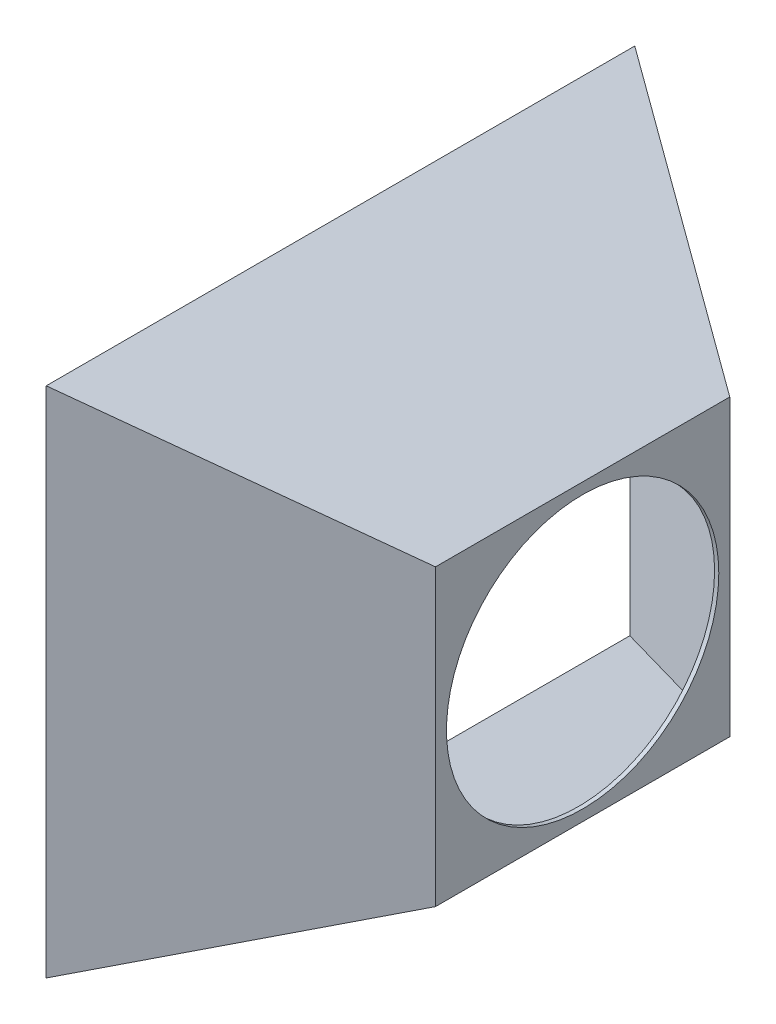
ISO-10303-21;
HEADER;
FILE_DESCRIPTION(('STEP AP214'),'2;1');
FILE_NAME('part.step','',(''),(''),'','','');
FILE_SCHEMA(('AUTOMOTIVE_DESIGN { 1 0 10303 214 1 1 1 1 }'));
ENDSEC;
DATA;
#1=APPLICATION_CONTEXT('core data for automotive mechanical design processes');
#2=APPLICATION_PROTOCOL_DEFINITION('international standard','automotive_design',2000,#1);
#3=PRODUCT_CONTEXT('',#1,'mechanical');
#4=PRODUCT('Part','Part','',(#3));
#5=PRODUCT_RELATED_PRODUCT_CATEGORY('part','',(#4));
#6=PRODUCT_DEFINITION_FORMATION('','',#4);
#7=PRODUCT_DEFINITION_CONTEXT('part definition',#1,'design');
#8=PRODUCT_DEFINITION('design','',#6,#7);
#9=PRODUCT_DEFINITION_SHAPE('','',#8);
#10=(LENGTH_UNIT() NAMED_UNIT(*) SI_UNIT(.MILLI.,.METRE.));
#11=(NAMED_UNIT(*) PLANE_ANGLE_UNIT() SI_UNIT($,.RADIAN.));
#12=(NAMED_UNIT(*) SI_UNIT($,.STERADIAN.) SOLID_ANGLE_UNIT());
#13=UNCERTAINTY_MEASURE_WITH_UNIT(LENGTH_MEASURE(1.E-05),#10,'distance_accuracy_value','');
#14=(GEOMETRIC_REPRESENTATION_CONTEXT(3) GLOBAL_UNCERTAINTY_ASSIGNED_CONTEXT((#13)) GLOBAL_UNIT_ASSIGNED_CONTEXT((#10,
#11,#12)) REPRESENTATION_CONTEXT('',''));
#15=CARTESIAN_POINT('',(0.,0.,0.));
#16=DIRECTION('',(0.,0.,1.));
#17=DIRECTION('',(1.,0.,0.));
#18=AXIS2_PLACEMENT_3D('',#15,#16,#17);
#19=CARTESIAN_POINT('',(288.,0.,0.));
#20=DIRECTION('',(1.,0.,0.));
#21=DIRECTION('',(0.,0.,-1.));
#22=AXIS2_PLACEMENT_3D('',#19,#20,#21);
#23=PLANE('',#22);
#24=CARTESIAN_POINT('',(288.,0.,0.));
#25=DIRECTION('',(1.,0.,0.));
#26=DIRECTION('',(0.,0.,-1.));
#27=AXIS2_PLACEMENT_3D('',#24,#25,#26);
#28=CIRCLE('',#27,161.95);
#29=CARTESIAN_POINT('',(288.,0.,-161.95));
#30=VERTEX_POINT('',#29);
#31=EDGE_CURVE('E310',#30,#30,#28,.T.);
#32=ORIENTED_EDGE('',*,*,#31,.F.);
#33=EDGE_LOOP('',(#32));
#34=FACE_BOUND('',#33,.T.);
#35=DIRECTION('',(0.,-1.,0.));
#36=VECTOR('',#35,1.);
#37=CARTESIAN_POINT('',(288.,-175.,175.));
#38=LINE('',#37,#36);
#39=CARTESIAN_POINT('',(288.,175.,175.));
#40=VERTEX_POINT('',#39);
#41=CARTESIAN_POINT('',(288.,-175.,175.));
#42=VERTEX_POINT('',#41);
#43=EDGE_CURVE('E250',#40,#42,#38,.T.);
#44=ORIENTED_EDGE('',*,*,#43,.T.);
#45=DIRECTION('',(0.,0.,-1.));
#46=VECTOR('',#45,1.);
#47=CARTESIAN_POINT('',(288.,-175.,-175.));
#48=LINE('',#47,#46);
#49=CARTESIAN_POINT('',(288.,-175.,-175.));
#50=VERTEX_POINT('',#49);
#51=EDGE_CURVE('E12',#42,#50,#48,.T.);
#52=ORIENTED_EDGE('',*,*,#51,.T.);
#53=DIRECTION('',(0.,1.,0.));
#54=VECTOR('',#53,1.);
#55=CARTESIAN_POINT('',(288.,-175.,-175.));
#56=LINE('',#55,#54);
#57=CARTESIAN_POINT('',(288.,175.,-175.));
#58=VERTEX_POINT('',#57);
#59=EDGE_CURVE('E51',#50,#58,#56,.T.);
#60=ORIENTED_EDGE('',*,*,#59,.T.);
#61=DIRECTION('',(0.,0.,1.));
#62=VECTOR('',#61,1.);
#63=CARTESIAN_POINT('',(288.,175.,-175.));
#64=LINE('',#63,#62);
#65=EDGE_CURVE('E252',#58,#40,#64,.T.);
#66=ORIENTED_EDGE('',*,*,#65,.T.);
#67=EDGE_LOOP('',(#44,#52,#60,#66));
#68=FACE_BOUND('',#67,.T.);
#69=ADVANCED_FACE('F42',(#34,#68),#23,.T.);
#70=CARTESIAN_POINT('',(0.,0.,0.));
#71=DIRECTION('',(1.,0.,0.));
#72=DIRECTION('',(0.,0.,-1.));
#73=AXIS2_PLACEMENT_3D('',#70,#71,#72);
#74=PLANE('',#73);
#75=DIRECTION('',(0.,0.,1.));
#76=VECTOR('',#75,1.);
#77=CARTESIAN_POINT('',(0.,299.514218540143,0.));
#78=LINE('',#77,#76);
#79=CARTESIAN_POINT('',(0.,299.514218540143,-344.149305555555));
#80=VERTEX_POINT('',#79);
#81=CARTESIAN_POINT('',(0.,299.514218540143,344.149305555555));
#82=VERTEX_POINT('',#81);
#83=EDGE_CURVE('E137',#80,#82,#78,.T.);
#84=ORIENTED_EDGE('',*,*,#83,.T.);
#85=DIRECTION('',(0.,-1.,0.));
#86=VECTOR('',#85,1.);
#87=CARTESIAN_POINT('',(0.,0.,344.149305555555));
#88=LINE('',#87,#86);
#89=CARTESIAN_POINT('',(0.,-299.514218540143,344.149305555555));
#90=VERTEX_POINT('',#89);
#91=EDGE_CURVE('E140',#82,#90,#88,.T.);
#92=ORIENTED_EDGE('',*,*,#91,.T.);
#93=DIRECTION('',(0.,0.,-1.));
#94=VECTOR('',#93,1.);
#95=CARTESIAN_POINT('',(0.,-299.514218540143,0.));
#96=LINE('',#95,#94);
#97=CARTESIAN_POINT('',(0.,-299.514218540143,-344.149305555555));
#98=VERTEX_POINT('',#97);
#99=EDGE_CURVE('E142',#90,#98,#96,.T.);
#100=ORIENTED_EDGE('',*,*,#99,.T.);
#101=DIRECTION('',(0.,1.,0.));
#102=VECTOR('',#101,1.);
#103=CARTESIAN_POINT('',(0.,0.,-344.149305555555));
#104=LINE('',#103,#102);
#105=EDGE_CURVE('E59',#98,#80,#104,.T.);
#106=ORIENTED_EDGE('',*,*,#105,.T.);
#107=EDGE_LOOP('',(#84,#92,#100,#106));
#108=FACE_BOUND('',#107,.T.);
#109=DIRECTION('',(0.,-1.,0.));
#110=VECTOR('',#109,1.);
#111=CARTESIAN_POINT('',(0.,-305.,350.));
#112=LINE('',#111,#110);
#113=CARTESIAN_POINT('',(0.,305.,350.));
#114=VERTEX_POINT('',#113);
#115=CARTESIAN_POINT('',(0.,-305.,350.));
#116=VERTEX_POINT('',#115);
#117=EDGE_CURVE('E120',#114,#116,#112,.T.);
#118=ORIENTED_EDGE('',*,*,#117,.F.);
#119=DIRECTION('',(0.,0.,1.));
#120=VECTOR('',#119,1.);
#121=CARTESIAN_POINT('',(0.,305.,-350.));
#122=LINE('',#121,#120);
#123=CARTESIAN_POINT('',(0.,305.,-350.));
#124=VERTEX_POINT('',#123);
#125=EDGE_CURVE('E224',#124,#114,#122,.T.);
#126=ORIENTED_EDGE('',*,*,#125,.F.);
#127=DIRECTION('',(0.,1.,0.));
#128=VECTOR('',#127,1.);
#129=CARTESIAN_POINT('',(0.,-305.,-350.));
#130=LINE('',#129,#128);
#131=CARTESIAN_POINT('',(0.,-305.,-350.));
#132=VERTEX_POINT('',#131);
#133=EDGE_CURVE('E356',#132,#124,#130,.T.);
#134=ORIENTED_EDGE('',*,*,#133,.F.);
#135=DIRECTION('',(0.,0.,-1.));
#136=VECTOR('',#135,1.);
#137=CARTESIAN_POINT('',(0.,-305.,-350.));
#138=LINE('',#137,#136);
#139=EDGE_CURVE('E151',#116,#132,#138,.T.);
#140=ORIENTED_EDGE('',*,*,#139,.F.);
#141=EDGE_LOOP('',(#118,#126,#134,#140));
#142=FACE_BOUND('',#141,.T.);
#143=ADVANCED_FACE('F299',(#108,#142),#74,.F.);
#144=CARTESIAN_POINT('',(114.370417851849,253.374464164096,0.));
#145=DIRECTION('',(-0.41141712643131,-0.911447172401672,0.));
#146=DIRECTION('',(0.911447172401672,-0.41141712643131,0.));
#147=AXIS2_PLACEMENT_3D('',#144,#145,#146);
#148=PLANE('',#147);
#149=DIRECTION('',(0.797331314407417,-0.359906496086681,-0.48448951396284));
#150=VECTOR('',#149,1.);
#151=CARTESIAN_POINT('',(0.,305.,350.));
#152=LINE('',#151,#150);
#153=EDGE_CURVE('E216',#114,#40,#152,.T.);
#154=ORIENTED_EDGE('',*,*,#153,.T.);
#155=ORIENTED_EDGE('',*,*,#65,.F.);
#156=DIRECTION('',(0.797331314407417,-0.359906496086681,0.48448951396284));
#157=VECTOR('',#156,1.);
#158=CARTESIAN_POINT('',(0.,305.,-350.));
#159=LINE('',#158,#157);
#160=EDGE_CURVE('E209',#124,#58,#159,.T.);
#161=ORIENTED_EDGE('',*,*,#160,.F.);
#162=ORIENTED_EDGE('',*,*,#125,.T.);
#163=EDGE_LOOP('',(#154,#155,#161,#162));
#164=FACE_BOUND('',#163,.T.);
#165=ADVANCED_FACE('F199',(#164),#148,.F.);
#166=CARTESIAN_POINT('',(155.324076112319,0.,-255.619050973417));
#167=DIRECTION('',(-0.519287833827893,0.,0.85459940652819));
#168=DIRECTION('',(0.85459940652819,0.,0.519287833827893));
#169=AXIS2_PLACEMENT_3D('',#166,#167,#168);
#170=PLANE('',#169);
#171=ORIENTED_EDGE('',*,*,#160,.T.);
#172=ORIENTED_EDGE('',*,*,#59,.F.);
#173=DIRECTION('',(0.797331314407417,0.359906496086681,0.48448951396284));
#174=VECTOR('',#173,1.);
#175=CARTESIAN_POINT('',(0.,-305.,-350.));
#176=LINE('',#175,#174);
#177=EDGE_CURVE('E249',#132,#50,#176,.T.);
#178=ORIENTED_EDGE('',*,*,#177,.F.);
#179=ORIENTED_EDGE('',*,*,#133,.T.);
#180=EDGE_LOOP('',(#171,#172,#178,#179));
#181=FACE_BOUND('',#180,.T.);
#182=ADVANCED_FACE('F190',(#181),#170,.F.);
#183=CARTESIAN_POINT('',(155.324076112319,0.,255.619050973417));
#184=DIRECTION('',(-0.519287833827893,0.,-0.85459940652819));
#185=DIRECTION('',(-0.85459940652819,0.,0.519287833827893));
#186=AXIS2_PLACEMENT_3D('',#183,#184,#185);
#187=PLANE('',#186);
#188=DIRECTION('',(0.797331314407417,0.359906496086681,-0.48448951396284));
#189=VECTOR('',#188,1.);
#190=CARTESIAN_POINT('',(0.,-305.,350.));
#191=LINE('',#190,#189);
#192=EDGE_CURVE('E67',#116,#42,#191,.T.);
#193=ORIENTED_EDGE('',*,*,#192,.T.);
#194=ORIENTED_EDGE('',*,*,#43,.F.);
#195=ORIENTED_EDGE('',*,*,#153,.F.);
#196=ORIENTED_EDGE('',*,*,#117,.T.);
#197=EDGE_LOOP('',(#193,#194,#195,#196));
#198=FACE_BOUND('',#197,.T.);
#199=ADVANCED_FACE('F166',(#198),#187,.F.);
#200=CARTESIAN_POINT('',(114.370417851849,-253.374464164096,0.));
#201=DIRECTION('',(-0.411417126431311,0.911447172401672,0.));
#202=DIRECTION('',(-0.911447172401672,-0.411417126431311,0.));
#203=AXIS2_PLACEMENT_3D('',#200,#201,#202);
#204=PLANE('',#203);
#205=ORIENTED_EDGE('',*,*,#177,.T.);
#206=ORIENTED_EDGE('',*,*,#51,.F.);
#207=ORIENTED_EDGE('',*,*,#192,.F.);
#208=ORIENTED_EDGE('',*,*,#139,.T.);
#209=EDGE_LOOP('',(#205,#206,#207,#208));
#210=FACE_BOUND('',#209,.T.);
#211=ADVANCED_FACE('F157',(#210),#204,.F.);
#212=CARTESIAN_POINT('',(283.,0.,0.));
#213=DIRECTION('',(1.,0.,0.));
#214=DIRECTION('',(0.,0.,-1.));
#215=AXIS2_PLACEMENT_3D('',#212,#213,#214);
#216=PLANE('',#215);
#217=CARTESIAN_POINT('',(283.,0.,0.));
#218=DIRECTION('',(1.,0.,0.));
#219=DIRECTION('',(0.,0.,-1.));
#220=AXIS2_PLACEMENT_3D('',#217,#218,#219);
#221=CIRCLE('',#220,161.95);
#222=CARTESIAN_POINT('',(283.,0.,-161.95));
#223=VERTEX_POINT('',#222);
#224=EDGE_CURVE('E46',#223,#223,#221,.T.);
#225=ORIENTED_EDGE('',*,*,#224,.T.);
#226=EDGE_LOOP('',(#225));
#227=FACE_BOUND('',#226,.T.);
#228=DIRECTION('',(0.,-1.,0.));
#229=VECTOR('',#228,1.);
#230=CARTESIAN_POINT('',(283.,0.,172.1875));
#231=LINE('',#230,#229);
#232=CARTESIAN_POINT('',(283.,171.771162984588,172.1875));
#233=VERTEX_POINT('',#232);
#234=CARTESIAN_POINT('',(283.,-171.771162984588,172.1875));
#235=VERTEX_POINT('',#234);
#236=EDGE_CURVE('E129',#233,#235,#231,.T.);
#237=ORIENTED_EDGE('',*,*,#236,.F.);
#238=DIRECTION('',(0.,0.,1.));
#239=VECTOR('',#238,1.);
#240=CARTESIAN_POINT('',(283.,171.771162984588,0.));
#241=LINE('',#240,#239);
#242=CARTESIAN_POINT('',(283.,171.771162984588,-172.1875));
#243=VERTEX_POINT('',#242);
#244=EDGE_CURVE('E125',#243,#233,#241,.T.);
#245=ORIENTED_EDGE('',*,*,#244,.F.);
#246=DIRECTION('',(0.,1.,0.));
#247=VECTOR('',#246,1.);
#248=CARTESIAN_POINT('',(283.,0.,-172.1875));
#249=LINE('',#248,#247);
#250=CARTESIAN_POINT('',(283.,-171.771162984588,-172.1875));
#251=VERTEX_POINT('',#250);
#252=EDGE_CURVE('E121',#251,#243,#249,.T.);
#253=ORIENTED_EDGE('',*,*,#252,.F.);
#254=DIRECTION('',(0.,0.,-1.));
#255=VECTOR('',#254,1.);
#256=CARTESIAN_POINT('',(283.,-171.771162984588,0.));
#257=LINE('',#256,#255);
#258=EDGE_CURVE('E110',#235,#251,#257,.T.);
#259=ORIENTED_EDGE('',*,*,#258,.F.);
#260=EDGE_LOOP('',(#237,#245,#253,#259));
#261=FACE_BOUND('',#260,.T.);
#262=ADVANCED_FACE('F124',(#227,#261),#216,.F.);
#263=CARTESIAN_POINT('',(112.313332219692,248.817228302088,0.));
#264=DIRECTION('',(-0.41141712643131,-0.911447172401672,0.));
#265=DIRECTION('',(0.911447172401672,-0.41141712643131,0.));
#266=AXIS2_PLACEMENT_3D('',#263,#264,#265);
#267=PLANE('',#266);
#268=DIRECTION('',(0.797331314407417,-0.359906496086681,-0.48448951396284));
#269=VECTOR('',#268,1.);
#270=CARTESIAN_POINT('',(218.894429651051,200.707705155988,211.140537538424));
#271=LINE('',#270,#269);
#272=EDGE_CURVE('E144',#82,#233,#271,.T.);
#273=ORIENTED_EDGE('',*,*,#272,.F.);
#274=ORIENTED_EDGE('',*,*,#83,.F.);
#275=DIRECTION('',(0.797331314407417,-0.359906496086681,0.48448951396284));
#276=VECTOR('',#275,1.);
#277=CARTESIAN_POINT('',(218.894429651051,200.707705155988,-211.140537538424));
#278=LINE('',#277,#276);
#279=EDGE_CURVE('E132',#80,#243,#278,.T.);
#280=ORIENTED_EDGE('',*,*,#279,.T.);
#281=ORIENTED_EDGE('',*,*,#244,.T.);
#282=EDGE_LOOP('',(#273,#274,#280,#281));
#283=FACE_BOUND('',#282,.T.);
#284=ADVANCED_FACE('F320',(#283),#267,.T.);
#285=CARTESIAN_POINT('',(152.72763694318,0.,-251.346053940776));
#286=DIRECTION('',(-0.519287833827893,0.,0.85459940652819));
#287=DIRECTION('',(0.85459940652819,0.,0.519287833827893));
#288=AXIS2_PLACEMENT_3D('',#285,#286,#287);
#289=PLANE('',#288);
#290=ORIENTED_EDGE('',*,*,#279,.F.);
#291=ORIENTED_EDGE('',*,*,#105,.F.);
#292=DIRECTION('',(0.797331314407417,0.359906496086681,0.48448951396284));
#293=VECTOR('',#292,1.);
#294=CARTESIAN_POINT('',(218.894429651051,-200.707705155988,-211.140537538424));
#295=LINE('',#294,#293);
#296=EDGE_CURVE('E113',#98,#251,#295,.T.);
#297=ORIENTED_EDGE('',*,*,#296,.T.);
#298=ORIENTED_EDGE('',*,*,#252,.T.);
#299=EDGE_LOOP('',(#290,#291,#297,#298));
#300=FACE_BOUND('',#299,.T.);
#301=ADVANCED_FACE('F128',(#300),#289,.T.);
#302=CARTESIAN_POINT('',(152.72763694318,0.,251.346053940776));
#303=DIRECTION('',(-0.519287833827893,0.,-0.85459940652819));
#304=DIRECTION('',(-0.85459940652819,0.,0.519287833827893));
#305=AXIS2_PLACEMENT_3D('',#302,#303,#304);
#306=PLANE('',#305);
#307=DIRECTION('',(0.797331314407417,0.359906496086681,-0.48448951396284));
#308=VECTOR('',#307,1.);
#309=CARTESIAN_POINT('',(218.894429651051,-200.707705155988,211.140537538424));
#310=LINE('',#309,#308);
#311=EDGE_CURVE('E116',#90,#235,#310,.T.);
#312=ORIENTED_EDGE('',*,*,#311,.F.);
#313=ORIENTED_EDGE('',*,*,#91,.F.);
#314=ORIENTED_EDGE('',*,*,#272,.T.);
#315=ORIENTED_EDGE('',*,*,#236,.T.);
#316=EDGE_LOOP('',(#312,#313,#314,#315));
#317=FACE_BOUND('',#316,.T.);
#318=ADVANCED_FACE('F321',(#317),#306,.T.);
#319=CARTESIAN_POINT('',(112.313332219692,-248.817228302088,0.));
#320=DIRECTION('',(-0.411417126431311,0.911447172401672,0.));
#321=DIRECTION('',(-0.911447172401672,-0.411417126431311,0.));
#322=AXIS2_PLACEMENT_3D('',#319,#320,#321);
#323=PLANE('',#322);
#324=ORIENTED_EDGE('',*,*,#296,.F.);
#325=ORIENTED_EDGE('',*,*,#99,.F.);
#326=ORIENTED_EDGE('',*,*,#311,.T.);
#327=ORIENTED_EDGE('',*,*,#258,.T.);
#328=EDGE_LOOP('',(#324,#325,#326,#327));
#329=FACE_BOUND('',#328,.T.);
#330=ADVANCED_FACE('F112',(#329),#323,.T.);
#331=CARTESIAN_POINT('',(278.,0.,0.));
#332=DIRECTION('',(1.,0.,0.));
#333=DIRECTION('',(0.,0.,-1.));
#334=AXIS2_PLACEMENT_3D('',#331,#332,#333);
#335=CYLINDRICAL_SURFACE('',#334,161.95);
#336=ORIENTED_EDGE('',*,*,#31,.T.);
#337=EDGE_LOOP('',(#336));
#338=FACE_BOUND('',#337,.T.);
#339=ORIENTED_EDGE('',*,*,#224,.F.);
#340=EDGE_LOOP('',(#339));
#341=FACE_BOUND('',#340,.T.);
#342=ADVANCED_FACE('F328',(#338,#341),#335,.F.);
#343=CLOSED_SHELL('',(#69,#143,#165,#182,#199,#211,#262,#284,#301,#318,#330,#342));
#344=MANIFOLD_SOLID_BREP('B2',#343);
#345=ADVANCED_BREP_SHAPE_REPRESENTATION('',(#18,#344),#14);
#346=SHAPE_DEFINITION_REPRESENTATION(#9,#345);
ENDSEC;
END-ISO-10303-21;
